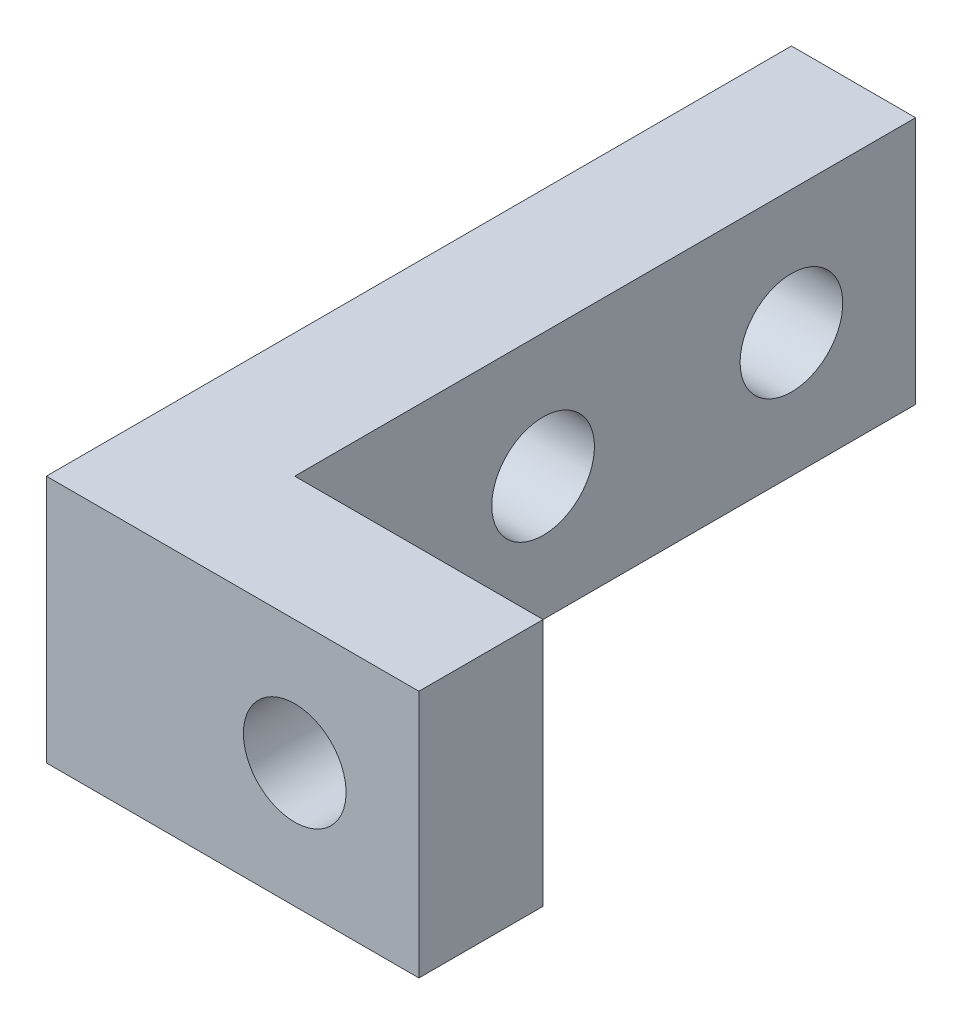
ISO-10303-21;
HEADER;
FILE_DESCRIPTION(('STEP AP214'),'2;1');
FILE_NAME('part.step','',(''),(''),'','','');
FILE_SCHEMA(('AUTOMOTIVE_DESIGN { 1 0 10303 214 1 1 1 1 }'));
ENDSEC;
DATA;
#1=APPLICATION_CONTEXT('core data for automotive mechanical design processes');
#2=APPLICATION_PROTOCOL_DEFINITION('international standard','automotive_design',2000,#1);
#3=PRODUCT_CONTEXT('',#1,'mechanical');
#4=PRODUCT('Part','Part','',(#3));
#5=PRODUCT_RELATED_PRODUCT_CATEGORY('part','',(#4));
#6=PRODUCT_DEFINITION_FORMATION('','',#4);
#7=PRODUCT_DEFINITION_CONTEXT('part definition',#1,'design');
#8=PRODUCT_DEFINITION('design','',#6,#7);
#9=PRODUCT_DEFINITION_SHAPE('','',#8);
#10=(LENGTH_UNIT() NAMED_UNIT(*) SI_UNIT(.MILLI.,.METRE.));
#11=(NAMED_UNIT(*) PLANE_ANGLE_UNIT() SI_UNIT($,.RADIAN.));
#12=(NAMED_UNIT(*) SI_UNIT($,.STERADIAN.) SOLID_ANGLE_UNIT());
#13=UNCERTAINTY_MEASURE_WITH_UNIT(LENGTH_MEASURE(1.E-05),#10,'distance_accuracy_value','');
#14=(GEOMETRIC_REPRESENTATION_CONTEXT(3) GLOBAL_UNCERTAINTY_ASSIGNED_CONTEXT((#13)) GLOBAL_UNIT_ASSIGNED_CONTEXT((#10,
#11,#12)) REPRESENTATION_CONTEXT('',''));
#15=CARTESIAN_POINT('',(0.,0.,0.));
#16=DIRECTION('',(0.,0.,1.));
#17=DIRECTION('',(1.,0.,0.));
#18=AXIS2_PLACEMENT_3D('',#15,#16,#17);
#19=CARTESIAN_POINT('',(0.,12.7,0.));
#20=DIRECTION('',(0.,0.,-1.));
#21=DIRECTION('',(-1.,0.,0.));
#22=AXIS2_PLACEMENT_3D('',#19,#20,#21);
#23=PLANE('',#22);
#24=CARTESIAN_POINT('',(12.7,6.35,0.));
#25=DIRECTION('',(0.,0.,-1.));
#26=DIRECTION('',(-1.,0.,0.));
#27=AXIS2_PLACEMENT_3D('',#24,#25,#26);
#28=CIRCLE('',#27,2.62499999999999);
#29=CARTESIAN_POINT('',(10.075,6.35,0.));
#30=VERTEX_POINT('',#29);
#31=EDGE_CURVE('E163',#30,#30,#28,.T.);
#32=ORIENTED_EDGE('',*,*,#31,.T.);
#33=EDGE_LOOP('',(#32));
#34=FACE_BOUND('',#33,.T.);
#35=DIRECTION('',(1.,0.,0.));
#36=VECTOR('',#35,1.);
#37=CARTESIAN_POINT('',(0.,0.,0.));
#38=LINE('',#37,#36);
#39=CARTESIAN_POINT('',(0.,0.,0.));
#40=VERTEX_POINT('',#39);
#41=CARTESIAN_POINT('',(19.05,0.,0.));
#42=VERTEX_POINT('',#41);
#43=EDGE_CURVE('E117',#40,#42,#38,.T.);
#44=ORIENTED_EDGE('',*,*,#43,.T.);
#45=DIRECTION('',(0.,-1.,0.));
#46=VECTOR('',#45,1.);
#47=CARTESIAN_POINT('',(19.05,12.7,0.));
#48=LINE('',#47,#46);
#49=CARTESIAN_POINT('',(19.05,12.7,0.));
#50=VERTEX_POINT('',#49);
#51=EDGE_CURVE('E11',#50,#42,#48,.T.);
#52=ORIENTED_EDGE('',*,*,#51,.F.);
#53=DIRECTION('',(1.,0.,0.));
#54=VECTOR('',#53,1.);
#55=CARTESIAN_POINT('',(0.,12.7,0.));
#56=LINE('',#55,#54);
#57=CARTESIAN_POINT('',(0.,12.7,0.));
#58=VERTEX_POINT('',#57);
#59=EDGE_CURVE('E82',#58,#50,#56,.T.);
#60=ORIENTED_EDGE('',*,*,#59,.F.);
#61=DIRECTION('',(0.,-1.,0.));
#62=VECTOR('',#61,1.);
#63=CARTESIAN_POINT('',(0.,12.7,0.));
#64=LINE('',#63,#62);
#65=EDGE_CURVE('E51',#58,#40,#64,.T.);
#66=ORIENTED_EDGE('',*,*,#65,.T.);
#67=EDGE_LOOP('',(#44,#52,#60,#66));
#68=FACE_BOUND('',#67,.T.);
#69=ADVANCED_FACE('F35',(#34,#68),#23,.F.);
#70=CARTESIAN_POINT('',(19.05,12.7,0.));
#71=DIRECTION('',(1.,0.,0.));
#72=DIRECTION('',(0.,0.,-1.));
#73=AXIS2_PLACEMENT_3D('',#70,#71,#72);
#74=PLANE('',#73);
#75=DIRECTION('',(0.,0.,1.));
#76=VECTOR('',#75,1.);
#77=CARTESIAN_POINT('',(19.05,0.,0.));
#78=LINE('',#77,#76);
#79=CARTESIAN_POINT('',(19.05,0.,-6.35));
#80=VERTEX_POINT('',#79);
#81=EDGE_CURVE('E119',#80,#42,#78,.T.);
#82=ORIENTED_EDGE('',*,*,#81,.F.);
#83=DIRECTION('',(0.,-1.,0.));
#84=VECTOR('',#83,1.);
#85=CARTESIAN_POINT('',(19.05,12.7,-6.35));
#86=LINE('',#85,#84);
#87=CARTESIAN_POINT('',(19.05,12.7,-6.35));
#88=VERTEX_POINT('',#87);
#89=EDGE_CURVE('E43',#88,#80,#86,.T.);
#90=ORIENTED_EDGE('',*,*,#89,.F.);
#91=DIRECTION('',(0.,0.,1.));
#92=VECTOR('',#91,1.);
#93=CARTESIAN_POINT('',(19.05,12.7,0.));
#94=LINE('',#93,#92);
#95=EDGE_CURVE('E164',#88,#50,#94,.T.);
#96=ORIENTED_EDGE('',*,*,#95,.T.);
#97=ORIENTED_EDGE('',*,*,#51,.T.);
#98=EDGE_LOOP('',(#82,#90,#96,#97));
#99=FACE_BOUND('',#98,.T.);
#100=ADVANCED_FACE('F140',(#99),#74,.T.);
#101=CARTESIAN_POINT('',(0.,12.7,-6.35));
#102=DIRECTION('',(0.,0.,-1.));
#103=DIRECTION('',(-1.,0.,0.));
#104=AXIS2_PLACEMENT_3D('',#101,#102,#103);
#105=PLANE('',#104);
#106=CARTESIAN_POINT('',(12.7,6.35,-6.35));
#107=DIRECTION('',(0.,0.,-1.));
#108=DIRECTION('',(-1.,0.,0.));
#109=AXIS2_PLACEMENT_3D('',#106,#107,#108);
#110=CIRCLE('',#109,2.62499999999999);
#111=CARTESIAN_POINT('',(10.075,6.35,-6.35));
#112=VERTEX_POINT('',#111);
#113=EDGE_CURVE('E180',#112,#112,#110,.T.);
#114=ORIENTED_EDGE('',*,*,#113,.F.);
#115=EDGE_LOOP('',(#114));
#116=FACE_BOUND('',#115,.T.);
#117=DIRECTION('',(1.,0.,0.));
#118=VECTOR('',#117,1.);
#119=CARTESIAN_POINT('',(0.,0.,-6.35));
#120=LINE('',#119,#118);
#121=CARTESIAN_POINT('',(6.35,0.,-6.35));
#122=VERTEX_POINT('',#121);
#123=EDGE_CURVE('E123',#122,#80,#120,.T.);
#124=ORIENTED_EDGE('',*,*,#123,.F.);
#125=DIRECTION('',(0.,-1.,0.));
#126=VECTOR('',#125,1.);
#127=CARTESIAN_POINT('',(6.35,12.7,-6.35));
#128=LINE('',#127,#126);
#129=CARTESIAN_POINT('',(6.35,12.7,-6.35));
#130=VERTEX_POINT('',#129);
#131=EDGE_CURVE('E109',#130,#122,#128,.T.);
#132=ORIENTED_EDGE('',*,*,#131,.F.);
#133=DIRECTION('',(1.,0.,0.));
#134=VECTOR('',#133,1.);
#135=CARTESIAN_POINT('',(0.,12.7,-6.35));
#136=LINE('',#135,#134);
#137=EDGE_CURVE('E99',#130,#88,#136,.T.);
#138=ORIENTED_EDGE('',*,*,#137,.T.);
#139=ORIENTED_EDGE('',*,*,#89,.T.);
#140=EDGE_LOOP('',(#124,#132,#138,#139));
#141=FACE_BOUND('',#140,.T.);
#142=ADVANCED_FACE('F137',(#116,#141),#105,.T.);
#143=CARTESIAN_POINT('',(6.35,12.7,0.));
#144=DIRECTION('',(-1.,0.,0.));
#145=DIRECTION('',(0.,0.,1.));
#146=AXIS2_PLACEMENT_3D('',#143,#144,#145);
#147=PLANE('',#146);
#148=CARTESIAN_POINT('',(6.35,6.35,-31.75));
#149=DIRECTION('',(-1.,0.,0.));
#150=DIRECTION('',(0.,0.,1.));
#151=AXIS2_PLACEMENT_3D('',#148,#149,#150);
#152=CIRCLE('',#151,2.625);
#153=CARTESIAN_POINT('',(6.35,6.35,-29.125));
#154=VERTEX_POINT('',#153);
#155=EDGE_CURVE('E173',#154,#154,#152,.T.);
#156=ORIENTED_EDGE('',*,*,#155,.T.);
#157=EDGE_LOOP('',(#156));
#158=FACE_BOUND('',#157,.T.);
#159=CARTESIAN_POINT('',(6.35,6.35,-19.05));
#160=DIRECTION('',(-1.,0.,0.));
#161=DIRECTION('',(0.,0.,1.));
#162=AXIS2_PLACEMENT_3D('',#159,#160,#161);
#163=CIRCLE('',#162,2.625);
#164=CARTESIAN_POINT('',(6.35,6.35,-16.425));
#165=VERTEX_POINT('',#164);
#166=EDGE_CURVE('E120',#165,#165,#163,.T.);
#167=ORIENTED_EDGE('',*,*,#166,.T.);
#168=EDGE_LOOP('',(#167));
#169=FACE_BOUND('',#168,.T.);
#170=DIRECTION('',(0.,0.,-1.));
#171=VECTOR('',#170,1.);
#172=CARTESIAN_POINT('',(6.35,0.,0.));
#173=LINE('',#172,#171);
#174=CARTESIAN_POINT('',(6.35,0.,-38.1));
#175=VERTEX_POINT('',#174);
#176=EDGE_CURVE('E106',#122,#175,#173,.T.);
#177=ORIENTED_EDGE('',*,*,#176,.T.);
#178=DIRECTION('',(0.,-1.,0.));
#179=VECTOR('',#178,1.);
#180=CARTESIAN_POINT('',(6.35,12.7,-38.1));
#181=LINE('',#180,#179);
#182=CARTESIAN_POINT('',(6.35,12.7,-38.1));
#183=VERTEX_POINT('',#182);
#184=EDGE_CURVE('E103',#183,#175,#181,.T.);
#185=ORIENTED_EDGE('',*,*,#184,.F.);
#186=DIRECTION('',(0.,0.,-1.));
#187=VECTOR('',#186,1.);
#188=CARTESIAN_POINT('',(6.35,12.7,0.));
#189=LINE('',#188,#187);
#190=EDGE_CURVE('E93',#130,#183,#189,.T.);
#191=ORIENTED_EDGE('',*,*,#190,.F.);
#192=ORIENTED_EDGE('',*,*,#131,.T.);
#193=EDGE_LOOP('',(#177,#185,#191,#192));
#194=FACE_BOUND('',#193,.T.);
#195=ADVANCED_FACE('F104',(#158,#169,#194),#147,.F.);
#196=CARTESIAN_POINT('',(0.,12.7,-38.1));
#197=DIRECTION('',(0.,0.,-1.));
#198=DIRECTION('',(-1.,0.,0.));
#199=AXIS2_PLACEMENT_3D('',#196,#197,#198);
#200=PLANE('',#199);
#201=DIRECTION('',(1.,0.,0.));
#202=VECTOR('',#201,1.);
#203=CARTESIAN_POINT('',(0.,0.,-38.1));
#204=LINE('',#203,#202);
#205=CARTESIAN_POINT('',(0.,0.,-38.1));
#206=VERTEX_POINT('',#205);
#207=EDGE_CURVE('E127',#206,#175,#204,.T.);
#208=ORIENTED_EDGE('',*,*,#207,.F.);
#209=DIRECTION('',(0.,-1.,0.));
#210=VECTOR('',#209,1.);
#211=CARTESIAN_POINT('',(0.,12.7,-38.1));
#212=LINE('',#211,#210);
#213=CARTESIAN_POINT('',(0.,12.7,-38.1));
#214=VERTEX_POINT('',#213);
#215=EDGE_CURVE('E70',#214,#206,#212,.T.);
#216=ORIENTED_EDGE('',*,*,#215,.F.);
#217=DIRECTION('',(1.,0.,0.));
#218=VECTOR('',#217,1.);
#219=CARTESIAN_POINT('',(0.,12.7,-38.1));
#220=LINE('',#219,#218);
#221=EDGE_CURVE('E97',#214,#183,#220,.T.);
#222=ORIENTED_EDGE('',*,*,#221,.T.);
#223=ORIENTED_EDGE('',*,*,#184,.T.);
#224=EDGE_LOOP('',(#208,#216,#222,#223));
#225=FACE_BOUND('',#224,.T.);
#226=ADVANCED_FACE('F111',(#225),#200,.T.);
#227=CARTESIAN_POINT('',(0.,12.7,0.));
#228=DIRECTION('',(-1.,0.,0.));
#229=DIRECTION('',(0.,0.,1.));
#230=AXIS2_PLACEMENT_3D('',#227,#228,#229);
#231=PLANE('',#230);
#232=CARTESIAN_POINT('',(0.,6.35,-31.75));
#233=DIRECTION('',(-1.,0.,0.));
#234=DIRECTION('',(0.,0.,1.));
#235=AXIS2_PLACEMENT_3D('',#232,#233,#234);
#236=CIRCLE('',#235,2.625);
#237=CARTESIAN_POINT('',(0.,6.35,-29.125));
#238=VERTEX_POINT('',#237);
#239=EDGE_CURVE('E176',#238,#238,#236,.T.);
#240=ORIENTED_EDGE('',*,*,#239,.F.);
#241=EDGE_LOOP('',(#240));
#242=FACE_BOUND('',#241,.T.);
#243=CARTESIAN_POINT('',(0.,6.35,-19.05));
#244=DIRECTION('',(-1.,0.,0.));
#245=DIRECTION('',(0.,0.,1.));
#246=AXIS2_PLACEMENT_3D('',#243,#244,#245);
#247=CIRCLE('',#246,2.625);
#248=CARTESIAN_POINT('',(0.,6.35,-16.425));
#249=VERTEX_POINT('',#248);
#250=EDGE_CURVE('E170',#249,#249,#247,.T.);
#251=ORIENTED_EDGE('',*,*,#250,.F.);
#252=EDGE_LOOP('',(#251));
#253=FACE_BOUND('',#252,.T.);
#254=DIRECTION('',(0.,0.,-1.));
#255=VECTOR('',#254,1.);
#256=CARTESIAN_POINT('',(0.,0.,0.));
#257=LINE('',#256,#255);
#258=EDGE_CURVE('E129',#40,#206,#257,.T.);
#259=ORIENTED_EDGE('',*,*,#258,.F.);
#260=ORIENTED_EDGE('',*,*,#65,.F.);
#261=DIRECTION('',(0.,0.,-1.));
#262=VECTOR('',#261,1.);
#263=CARTESIAN_POINT('',(0.,12.7,0.));
#264=LINE('',#263,#262);
#265=EDGE_CURVE('E112',#58,#214,#264,.T.);
#266=ORIENTED_EDGE('',*,*,#265,.T.);
#267=ORIENTED_EDGE('',*,*,#215,.T.);
#268=EDGE_LOOP('',(#259,#260,#266,#267));
#269=FACE_BOUND('',#268,.T.);
#270=ADVANCED_FACE('F143',(#242,#253,#269),#231,.T.);
#271=CARTESIAN_POINT('',(0.,12.7,0.));
#272=DIRECTION('',(0.,1.,0.));
#273=DIRECTION('',(0.,0.,1.));
#274=AXIS2_PLACEMENT_3D('',#271,#272,#273);
#275=PLANE('',#274);
#276=ORIENTED_EDGE('',*,*,#59,.T.);
#277=ORIENTED_EDGE('',*,*,#95,.F.);
#278=ORIENTED_EDGE('',*,*,#137,.F.);
#279=ORIENTED_EDGE('',*,*,#190,.T.);
#280=ORIENTED_EDGE('',*,*,#221,.F.);
#281=ORIENTED_EDGE('',*,*,#265,.F.);
#282=EDGE_LOOP('',(#276,#277,#278,#279,#280,#281));
#283=FACE_BOUND('',#282,.T.);
#284=ADVANCED_FACE('F95',(#283),#275,.T.);
#285=CARTESIAN_POINT('',(0.,0.,0.));
#286=DIRECTION('',(0.,1.,0.));
#287=DIRECTION('',(0.,0.,1.));
#288=AXIS2_PLACEMENT_3D('',#285,#286,#287);
#289=PLANE('',#288);
#290=ORIENTED_EDGE('',*,*,#43,.F.);
#291=ORIENTED_EDGE('',*,*,#258,.T.);
#292=ORIENTED_EDGE('',*,*,#207,.T.);
#293=ORIENTED_EDGE('',*,*,#176,.F.);
#294=ORIENTED_EDGE('',*,*,#123,.T.);
#295=ORIENTED_EDGE('',*,*,#81,.T.);
#296=EDGE_LOOP('',(#290,#291,#292,#293,#294,#295));
#297=FACE_BOUND('',#296,.T.);
#298=ADVANCED_FACE('F142',(#297),#289,.F.);
#299=CARTESIAN_POINT('',(0.,6.35,-19.05));
#300=DIRECTION('',(-1.,0.,0.));
#301=DIRECTION('',(0.,0.,1.));
#302=AXIS2_PLACEMENT_3D('',#299,#300,#301);
#303=CYLINDRICAL_SURFACE('',#302,2.625);
#304=ORIENTED_EDGE('',*,*,#250,.T.);
#305=EDGE_LOOP('',(#304));
#306=FACE_BOUND('',#305,.T.);
#307=ORIENTED_EDGE('',*,*,#166,.F.);
#308=EDGE_LOOP('',(#307));
#309=FACE_BOUND('',#308,.T.);
#310=ADVANCED_FACE('F200',(#306,#309),#303,.F.);
#311=CARTESIAN_POINT('',(0.,6.35,-31.75));
#312=DIRECTION('',(-1.,0.,0.));
#313=DIRECTION('',(0.,0.,1.));
#314=AXIS2_PLACEMENT_3D('',#311,#312,#313);
#315=CYLINDRICAL_SURFACE('',#314,2.625);
#316=ORIENTED_EDGE('',*,*,#239,.T.);
#317=EDGE_LOOP('',(#316));
#318=FACE_BOUND('',#317,.T.);
#319=ORIENTED_EDGE('',*,*,#155,.F.);
#320=EDGE_LOOP('',(#319));
#321=FACE_BOUND('',#320,.T.);
#322=ADVANCED_FACE('F202',(#318,#321),#315,.F.);
#323=CARTESIAN_POINT('',(12.7,6.35,-6.35));
#324=DIRECTION('',(0.,0.,-1.));
#325=DIRECTION('',(-1.,0.,0.));
#326=AXIS2_PLACEMENT_3D('',#323,#324,#325);
#327=CYLINDRICAL_SURFACE('',#326,2.62499999999999);
#328=ORIENTED_EDGE('',*,*,#113,.T.);
#329=EDGE_LOOP('',(#328));
#330=FACE_BOUND('',#329,.T.);
#331=ORIENTED_EDGE('',*,*,#31,.F.);
#332=EDGE_LOOP('',(#331));
#333=FACE_BOUND('',#332,.T.);
#334=ADVANCED_FACE('F184',(#330,#333),#327,.F.);
#335=CLOSED_SHELL('',(#69,#100,#142,#195,#226,#270,#284,#298,#310,#322,#334));
#336=MANIFOLD_SOLID_BREP('B2',#335);
#337=ADVANCED_BREP_SHAPE_REPRESENTATION('',(#18,#336),#14);
#338=SHAPE_DEFINITION_REPRESENTATION(#9,#337);
ENDSEC;
END-ISO-10303-21;
